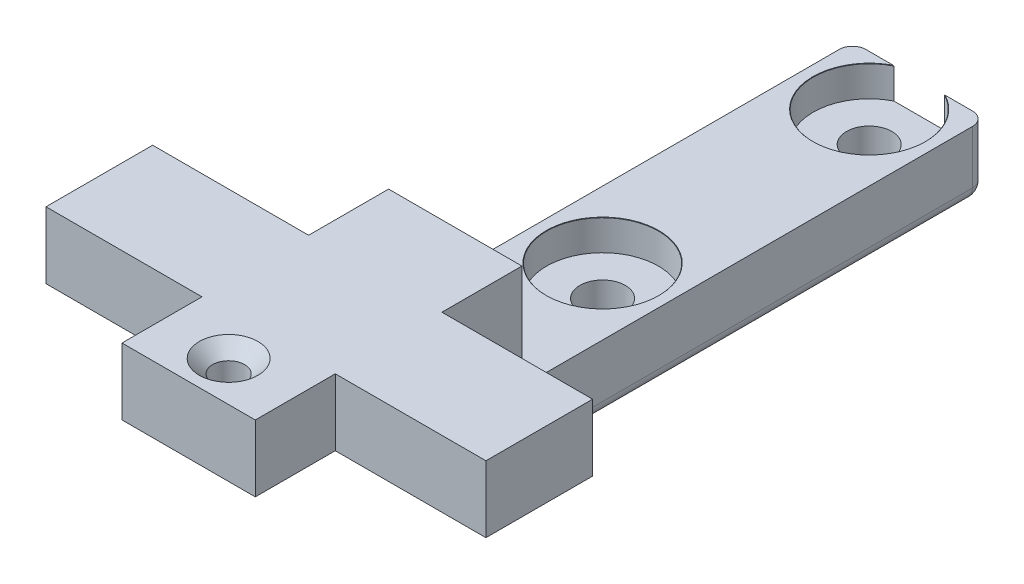
ISO-10303-21;
HEADER;
FILE_DESCRIPTION(('STEP AP214'),'2;1');
FILE_NAME('part.step','',(''),(''),'','','');
FILE_SCHEMA(('AUTOMOTIVE_DESIGN { 1 0 10303 214 1 1 1 1 }'));
ENDSEC;
DATA;
#1=APPLICATION_CONTEXT('core data for automotive mechanical design processes');
#2=APPLICATION_PROTOCOL_DEFINITION('international standard','automotive_design',2000,#1);
#3=PRODUCT_CONTEXT('',#1,'mechanical');
#4=PRODUCT('Part','Part','',(#3));
#5=PRODUCT_RELATED_PRODUCT_CATEGORY('part','',(#4));
#6=PRODUCT_DEFINITION_FORMATION('','',#4);
#7=PRODUCT_DEFINITION_CONTEXT('part definition',#1,'design');
#8=PRODUCT_DEFINITION('design','',#6,#7);
#9=PRODUCT_DEFINITION_SHAPE('','',#8);
#10=(LENGTH_UNIT() NAMED_UNIT(*) SI_UNIT(.MILLI.,.METRE.));
#11=(NAMED_UNIT(*) PLANE_ANGLE_UNIT() SI_UNIT($,.RADIAN.));
#12=(NAMED_UNIT(*) SI_UNIT($,.STERADIAN.) SOLID_ANGLE_UNIT());
#13=UNCERTAINTY_MEASURE_WITH_UNIT(LENGTH_MEASURE(1.E-05),#10,'distance_accuracy_value','');
#14=(GEOMETRIC_REPRESENTATION_CONTEXT(3) GLOBAL_UNCERTAINTY_ASSIGNED_CONTEXT((#13)) GLOBAL_UNIT_ASSIGNED_CONTEXT((#10,
#11,#12)) REPRESENTATION_CONTEXT('',''));
#15=CARTESIAN_POINT('',(0.,0.,0.));
#16=DIRECTION('',(0.,0.,1.));
#17=DIRECTION('',(1.,0.,0.));
#18=AXIS2_PLACEMENT_3D('',#15,#16,#17);
#19=CARTESIAN_POINT('',(0.,0.,3.83624546905827));
#20=DIRECTION('',(0.,0.,-1.));
#21=DIRECTION('',(-1.,0.,0.));
#22=AXIS2_PLACEMENT_3D('',#19,#20,#21);
#23=PLANE('',#22);
#24=DIRECTION('',(0.,-1.,0.));
#25=VECTOR('',#24,1.);
#26=CARTESIAN_POINT('',(0.,7.83,3.83624546905827));
#27=LINE('',#26,#25);
#28=CARTESIAN_POINT('',(0.,12.83,3.83624546905827));
#29=VERTEX_POINT('',#28);
#30=CARTESIAN_POINT('',(0.,7.83,3.83624546905827));
#31=VERTEX_POINT('',#30);
#32=EDGE_CURVE('E335',#29,#31,#27,.T.);
#33=ORIENTED_EDGE('',*,*,#32,.F.);
#34=DIRECTION('',(-1.,0.,0.));
#35=VECTOR('',#34,1.);
#36=CARTESIAN_POINT('',(21.3,12.83,3.83624546905827));
#37=LINE('',#36,#35);
#38=CARTESIAN_POINT('',(-11.7,12.83,3.83624546905827));
#39=VERTEX_POINT('',#38);
#40=EDGE_CURVE('E355',#29,#39,#37,.T.);
#41=ORIENTED_EDGE('',*,*,#40,.T.);
#42=DIRECTION('',(0.,-1.,0.));
#43=VECTOR('',#42,1.);
#44=CARTESIAN_POINT('',(-11.7,12.83,3.83624546905827));
#45=LINE('',#44,#43);
#46=CARTESIAN_POINT('',(-11.7,7.83,3.83624546905827));
#47=VERTEX_POINT('',#46);
#48=EDGE_CURVE('E359',#39,#47,#45,.T.);
#49=ORIENTED_EDGE('',*,*,#48,.T.);
#50=DIRECTION('',(1.,0.,0.));
#51=VECTOR('',#50,1.);
#52=CARTESIAN_POINT('',(21.3,7.83,3.83624546905827));
#53=LINE('',#52,#51);
#54=EDGE_CURVE('E362',#47,#31,#53,.T.);
#55=ORIENTED_EDGE('',*,*,#54,.T.);
#56=EDGE_LOOP('',(#33,#41,#49,#55));
#57=FACE_BOUND('',#56,.T.);
#58=ADVANCED_FACE('F33',(#57),#23,.F.);
#59=DIRECTION('',(0.,1.,0.));
#60=VECTOR('',#59,1.);
#61=CARTESIAN_POINT('',(10.,7.83,3.83624546905827));
#62=LINE('',#61,#60);
#63=CARTESIAN_POINT('',(10.,7.83,3.83624546905827));
#64=VERTEX_POINT('',#63);
#65=CARTESIAN_POINT('',(10.,12.83,3.83624546905827));
#66=VERTEX_POINT('',#65);
#67=EDGE_CURVE('E328',#64,#66,#62,.T.);
#68=ORIENTED_EDGE('',*,*,#67,.F.);
#69=CARTESIAN_POINT('',(21.3,7.83,3.83624546905827));
#70=VERTEX_POINT('',#69);
#71=EDGE_CURVE('E361',#64,#70,#53,.T.);
#72=ORIENTED_EDGE('',*,*,#71,.T.);
#73=DIRECTION('',(0.,1.,0.));
#74=VECTOR('',#73,1.);
#75=CARTESIAN_POINT('',(21.3,12.83,3.83624546905827));
#76=LINE('',#75,#74);
#77=CARTESIAN_POINT('',(21.3,12.83,3.83624546905827));
#78=VERTEX_POINT('',#77);
#79=EDGE_CURVE('E352',#70,#78,#76,.T.);
#80=ORIENTED_EDGE('',*,*,#79,.T.);
#81=EDGE_CURVE('E357',#78,#66,#37,.T.);
#82=ORIENTED_EDGE('',*,*,#81,.T.);
#83=EDGE_LOOP('',(#68,#72,#80,#82));
#84=FACE_BOUND('',#83,.T.);
#85=ADVANCED_FACE('F440',(#84),#23,.F.);
#86=CARTESIAN_POINT('',(0.,5.,-4.16375453094173));
#87=DIRECTION('',(0.,0.,-1.));
#88=DIRECTION('',(-1.,0.,0.));
#89=AXIS2_PLACEMENT_3D('',#86,#87,#88);
#90=PLANE('',#89);
#91=DIRECTION('',(0.,-1.,0.));
#92=VECTOR('',#91,1.);
#93=CARTESIAN_POINT('',(10.,5.,-4.16375453094173));
#94=LINE('',#93,#92);
#95=CARTESIAN_POINT('',(10.,6.83,-4.16375453094173));
#96=VERTEX_POINT('',#95);
#97=CARTESIAN_POINT('',(10.,1.,-4.16375453094173));
#98=VERTEX_POINT('',#97);
#99=EDGE_CURVE('E411',#96,#98,#94,.T.);
#100=ORIENTED_EDGE('',*,*,#99,.F.);
#101=DIRECTION('',(1.,0.,0.));
#102=VECTOR('',#101,1.);
#103=CARTESIAN_POINT('',(0.,6.83,-4.16375453094173));
#104=LINE('',#103,#102);
#105=CARTESIAN_POINT('',(0.,6.83,-4.16375453094173));
#106=VERTEX_POINT('',#105);
#107=EDGE_CURVE('E240',#96,#106,#104,.F.);
#108=ORIENTED_EDGE('',*,*,#107,.T.);
#109=DIRECTION('',(0.,-1.,0.));
#110=VECTOR('',#109,1.);
#111=CARTESIAN_POINT('',(0.,5.,-4.16375453094173));
#112=LINE('',#111,#110);
#113=CARTESIAN_POINT('',(0.,1.,-4.16375453094173));
#114=VERTEX_POINT('',#113);
#115=EDGE_CURVE('E415',#106,#114,#112,.T.);
#116=ORIENTED_EDGE('',*,*,#115,.T.);
#117=DIRECTION('',(1.,0.,0.));
#118=VECTOR('',#117,1.);
#119=CARTESIAN_POINT('',(0.,1.,-4.16375453094173));
#120=LINE('',#119,#118);
#121=EDGE_CURVE('E237',#114,#98,#120,.T.);
#122=ORIENTED_EDGE('',*,*,#121,.T.);
#123=EDGE_LOOP('',(#100,#108,#116,#122));
#124=FACE_BOUND('',#123,.T.);
#125=ADVANCED_FACE('F446',(#124),#90,.F.);
#126=CARTESIAN_POINT('',(0.,5.,-44.9637545309417));
#127=DIRECTION('',(1.,0.,0.));
#128=DIRECTION('',(0.,0.,-1.));
#129=AXIS2_PLACEMENT_3D('',#126,#127,#128);
#130=PLANE('',#129);
#131=DIRECTION('',(0.,0.,1.));
#132=VECTOR('',#131,1.);
#133=CARTESIAN_POINT('',(0.,5.,-44.9637545309417));
#134=LINE('',#133,#132);
#135=CARTESIAN_POINT('',(0.,5.,-43.9637545309417));
#136=VERTEX_POINT('',#135);
#137=CARTESIAN_POINT('',(0.,5.,-10.1637545309417));
#138=VERTEX_POINT('',#137);
#139=EDGE_CURVE('E403',#136,#138,#134,.T.);
#140=ORIENTED_EDGE('',*,*,#139,.F.);
#141=DIRECTION('',(0.,-1.,0.));
#142=VECTOR('',#141,1.);
#143=CARTESIAN_POINT('',(0.,5.,-43.9637545309417));
#144=LINE('',#143,#142);
#145=CARTESIAN_POINT('',(0.,1.,-43.9637545309417));
#146=VERTEX_POINT('',#145);
#147=EDGE_CURVE('E257',#136,#146,#144,.T.);
#148=ORIENTED_EDGE('',*,*,#147,.T.);
#149=DIRECTION('',(0.,0.,1.));
#150=VECTOR('',#149,1.);
#151=CARTESIAN_POINT('',(0.,1.,-44.9637545309417));
#152=LINE('',#151,#150);
#153=EDGE_CURVE('E255',#146,#114,#152,.T.);
#154=ORIENTED_EDGE('',*,*,#153,.T.);
#155=ORIENTED_EDGE('',*,*,#115,.F.);
#156=CARTESIAN_POINT('',(0.,6.83,-3.16375453094173));
#157=DIRECTION('',(1.,0.,0.));
#158=DIRECTION('',(0.,0.,-1.));
#159=AXIS2_PLACEMENT_3D('',#156,#157,#158);
#160=CIRCLE('',#159,1.);
#161=CARTESIAN_POINT('',(0.,7.83,-3.16375453094173));
#162=VERTEX_POINT('',#161);
#163=EDGE_CURVE('E11',#106,#162,#160,.T.);
#164=ORIENTED_EDGE('',*,*,#163,.T.);
#165=DIRECTION('',(0.,0.,1.));
#166=VECTOR('',#165,1.);
#167=CARTESIAN_POINT('',(0.,7.83,-44.9637545309417));
#168=LINE('',#167,#166);
#169=CARTESIAN_POINT('',(0.,7.83,-4.16375453094173));
#170=VERTEX_POINT('',#169);
#171=EDGE_CURVE('E49',#170,#162,#168,.T.);
#172=ORIENTED_EDGE('',*,*,#171,.F.);
#173=CARTESIAN_POINT('',(0.,12.83,-4.16375453094173));
#174=VERTEX_POINT('',#173);
#175=EDGE_CURVE('E206',#174,#170,#112,.T.);
#176=ORIENTED_EDGE('',*,*,#175,.F.);
#177=DIRECTION('',(0.,0.,1.));
#178=VECTOR('',#177,1.);
#179=CARTESIAN_POINT('',(0.,12.83,-4.16375453094173));
#180=LINE('',#179,#178);
#181=CARTESIAN_POINT('',(0.,12.83,-10.1637545309417));
#182=VERTEX_POINT('',#181);
#183=EDGE_CURVE('E392',#182,#174,#180,.T.);
#184=ORIENTED_EDGE('',*,*,#183,.F.);
#185=DIRECTION('',(0.,-1.,0.));
#186=VECTOR('',#185,1.);
#187=CARTESIAN_POINT('',(0.,12.83,-10.1637545309417));
#188=LINE('',#187,#186);
#189=EDGE_CURVE('E395',#182,#138,#188,.T.);
#190=ORIENTED_EDGE('',*,*,#189,.T.);
#191=EDGE_LOOP('',(#140,#148,#154,#155,#164,#172,#176,#184,#190));
#192=FACE_BOUND('',#191,.T.);
#193=ADVANCED_FACE('F488',(#192),#130,.F.);
#194=CARTESIAN_POINT('',(10.,5.,-44.9637545309417));
#195=DIRECTION('',(-1.,0.,0.));
#196=DIRECTION('',(0.,0.,1.));
#197=AXIS2_PLACEMENT_3D('',#194,#195,#196);
#198=PLANE('',#197);
#199=ORIENTED_EDGE('',*,*,#99,.T.);
#200=DIRECTION('',(0.,0.,-1.));
#201=VECTOR('',#200,1.);
#202=CARTESIAN_POINT('',(10.,1.,-44.9637545309417));
#203=LINE('',#202,#201);
#204=CARTESIAN_POINT('',(10.,1.,-43.9637545309417));
#205=VERTEX_POINT('',#204);
#206=EDGE_CURVE('E253',#98,#205,#203,.T.);
#207=ORIENTED_EDGE('',*,*,#206,.T.);
#208=DIRECTION('',(0.,-1.,0.));
#209=VECTOR('',#208,1.);
#210=CARTESIAN_POINT('',(10.,5.,-43.9637545309417));
#211=LINE('',#210,#209);
#212=CARTESIAN_POINT('',(10.,5.,-43.9637545309417));
#213=VERTEX_POINT('',#212);
#214=EDGE_CURVE('E251',#205,#213,#211,.F.);
#215=ORIENTED_EDGE('',*,*,#214,.T.);
#216=DIRECTION('',(0.,0.,-1.));
#217=VECTOR('',#216,1.);
#218=CARTESIAN_POINT('',(10.,5.,-44.9637545309417));
#219=LINE('',#218,#217);
#220=CARTESIAN_POINT('',(10.,5.,-10.1637545309417));
#221=VERTEX_POINT('',#220);
#222=EDGE_CURVE('E405',#221,#213,#219,.T.);
#223=ORIENTED_EDGE('',*,*,#222,.F.);
#224=DIRECTION('',(0.,-1.,0.));
#225=VECTOR('',#224,1.);
#226=CARTESIAN_POINT('',(10.,12.83,-10.1637545309417));
#227=LINE('',#226,#225);
#228=CARTESIAN_POINT('',(10.,12.83,-10.1637545309417));
#229=VERTEX_POINT('',#228);
#230=EDGE_CURVE('E400',#229,#221,#227,.T.);
#231=ORIENTED_EDGE('',*,*,#230,.F.);
#232=DIRECTION('',(0.,0.,-1.));
#233=VECTOR('',#232,1.);
#234=CARTESIAN_POINT('',(10.,12.83,-4.16375453094173));
#235=LINE('',#234,#233);
#236=CARTESIAN_POINT('',(10.,12.83,-4.16375453094173));
#237=VERTEX_POINT('',#236);
#238=EDGE_CURVE('E387',#237,#229,#235,.T.);
#239=ORIENTED_EDGE('',*,*,#238,.F.);
#240=CARTESIAN_POINT('',(10.,7.83,-4.16375453094173));
#241=VERTEX_POINT('',#240);
#242=EDGE_CURVE('E412',#237,#241,#94,.T.);
#243=ORIENTED_EDGE('',*,*,#242,.T.);
#244=DIRECTION('',(0.,0.,-1.));
#245=VECTOR('',#244,1.);
#246=CARTESIAN_POINT('',(10.,7.83,-44.9637545309417));
#247=LINE('',#246,#245);
#248=CARTESIAN_POINT('',(10.,7.83,-3.16375453094173));
#249=VERTEX_POINT('',#248);
#250=EDGE_CURVE('E235',#249,#241,#247,.T.);
#251=ORIENTED_EDGE('',*,*,#250,.F.);
#252=CARTESIAN_POINT('',(10.,6.83,-3.16375453094173));
#253=DIRECTION('',(-1.,0.,0.));
#254=DIRECTION('',(0.,0.,1.));
#255=AXIS2_PLACEMENT_3D('',#252,#253,#254);
#256=CIRCLE('',#255,1.);
#257=EDGE_CURVE('E42',#249,#96,#256,.T.);
#258=ORIENTED_EDGE('',*,*,#257,.T.);
#259=EDGE_LOOP('',(#199,#207,#215,#223,#231,#239,#243,#251,#258));
#260=FACE_BOUND('',#259,.T.);
#261=ADVANCED_FACE('F485',(#260),#198,.F.);
#262=CARTESIAN_POINT('',(0.,5.,-44.9637545309417));
#263=DIRECTION('',(0.,0.,1.));
#264=DIRECTION('',(1.,0.,0.));
#265=AXIS2_PLACEMENT_3D('',#262,#263,#264);
#266=PLANE('',#265);
#267=DIRECTION('',(-1.,0.,0.));
#268=VECTOR('',#267,1.);
#269=CARTESIAN_POINT('',(0.,1.,-44.9637545309417));
#270=LINE('',#269,#268);
#271=CARTESIAN_POINT('',(9.,1.,-44.9637545309417));
#272=VERTEX_POINT('',#271);
#273=CARTESIAN_POINT('',(1.,1.,-44.9637545309417));
#274=VERTEX_POINT('',#273);
#275=EDGE_CURVE('E57',#272,#274,#270,.T.);
#276=ORIENTED_EDGE('',*,*,#275,.T.);
#277=DIRECTION('',(0.,-1.,0.));
#278=VECTOR('',#277,1.);
#279=CARTESIAN_POINT('',(1.,5.,-44.9637545309417));
#280=LINE('',#279,#278);
#281=CARTESIAN_POINT('',(1.,5.,-44.9637545309417));
#282=VERTEX_POINT('',#281);
#283=EDGE_CURVE('E262',#274,#282,#280,.F.);
#284=ORIENTED_EDGE('',*,*,#283,.T.);
#285=DIRECTION('',(-1.,0.,0.));
#286=VECTOR('',#285,1.);
#287=CARTESIAN_POINT('',(0.,5.,-44.9637545309417));
#288=LINE('',#287,#286);
#289=CARTESIAN_POINT('',(3.05368938758482,5.,-44.9637545309417));
#290=VERTEX_POINT('',#289);
#291=EDGE_CURVE('E408',#290,#282,#288,.T.);
#292=ORIENTED_EDGE('',*,*,#291,.F.);
#293=CARTESIAN_POINT('',(-3.50521343344667,10.0702221893006,-44.9637545309417));
#294=CARTESIAN_POINT('',(-3.38006383031921,9.9557112747247,-44.9637545309417));
#295=CARTESIAN_POINT('',(-3.25471173164179,9.84142176084376,-44.9637545309417));
#296=CARTESIAN_POINT('',(-3.00354421713998,9.61335096867708,-44.9637545309417));
#297=CARTESIAN_POINT('',(-2.87772879748715,9.49956969460822,-44.9637545309417));
#298=CARTESIAN_POINT('',(-2.49944315265946,9.15903518832231,-44.9637545309417));
#299=CARTESIAN_POINT('',(-2.24619307437607,8.933145857287,-44.9637545309417));
#300=CARTESIAN_POINT('',(-1.73525714478413,8.48288544879097,-44.9637545309417));
#301=CARTESIAN_POINT('',(-1.47755280228144,8.25853531963654,-44.9637545309417));
#302=CARTESIAN_POINT('',(-0.958544818709284,7.81408579408632,-44.9637545309417));
#303=CARTESIAN_POINT('',(-0.697241643544174,7.59398585616058,-44.9637545309417));
#304=CARTESIAN_POINT('',(-0.212340753148528,7.19491088458394,-44.9637545309417));
#305=CARTESIAN_POINT('',(0.0105197661774254,7.01504210524547,-44.9637545309417));
#306=CARTESIAN_POINT('',(0.460934086625559,6.66109460923798,-44.9637545309417));
#307=CARTESIAN_POINT('',(0.688489178353312,6.48701752009945,-44.9637545309417));
#308=CARTESIAN_POINT('',(1.03436033301427,6.23236014686013,-44.9637545309417));
#309=CARTESIAN_POINT('',(1.15033448708684,6.14860021890708,-44.9637545309417));
#310=CARTESIAN_POINT('',(1.38410912034105,5.98367421772422,-44.9637545309417));
#311=CARTESIAN_POINT('',(1.50190949608081,5.90250799837158,-44.9637545309417));
#312=CARTESIAN_POINT('',(1.73958294702353,5.74340327268832,-44.9637545309417));
#313=CARTESIAN_POINT('',(1.85945483383583,5.6654629974765,-44.9637545309417));
#314=CARTESIAN_POINT('',(2.10170549239995,5.51353407407672,-44.9637545309417));
#315=CARTESIAN_POINT('',(2.22408449947011,5.43954579919639,-44.9637545309417));
#316=CARTESIAN_POINT('',(2.46942868388189,5.29788032772839,-44.9637545309417));
#317=CARTESIAN_POINT('',(2.5923404886807,5.23011125107953,-44.9637545309417));
#318=CARTESIAN_POINT('',(2.84130048011066,5.10064240675096,-44.9637545309417));
#319=CARTESIAN_POINT('',(2.96734772483615,5.03894084329404,-44.9637545309417));
#320=CARTESIAN_POINT('',(3.22279307861923,4.92325429689572,-44.9637545309417));
#321=CARTESIAN_POINT('',(3.35218713190918,4.86926044750132,-44.9637545309417));
#322=CARTESIAN_POINT('',(3.6145984369742,4.7708810699504,-44.9637545309417));
#323=CARTESIAN_POINT('',(3.74761465066696,4.72649282086375,-44.9637545309417));
#324=CARTESIAN_POINT('',(3.99031819098881,4.65717103685499,-44.9637545309417));
#325=CARTESIAN_POINT('',(4.09939859629446,4.63012495217266,-44.9637545309417));
#326=CARTESIAN_POINT('',(4.31936969015652,4.58474906691519,-44.9637545309417));
#327=CARTESIAN_POINT('',(4.4302601221872,4.56641804210515,-44.9637545309417));
#328=CARTESIAN_POINT('',(4.65295406011985,4.53940726873561,-44.9637545309417));
#329=CARTESIAN_POINT('',(4.76475469709095,4.53070420635281,-44.9637545309417));
#330=CARTESIAN_POINT('',(4.9886906540197,4.52334731231274,-44.9637545309417));
#331=CARTESIAN_POINT('',(5.1008259704427,4.52469337489629,-44.9637545309417));
#332=CARTESIAN_POINT('',(5.32442550804682,4.53735287218826,-44.9637545309417));
#333=CARTESIAN_POINT('',(5.43589022756192,4.54865764774182,-44.9637545309417));
#334=CARTESIAN_POINT('',(5.65746007346739,4.58061770542398,-44.9637545309417));
#335=CARTESIAN_POINT('',(5.76756508248875,4.6012737890333,-44.9637545309417));
#336=CARTESIAN_POINT('',(5.98615675524417,4.6510336664652,-44.9637545309417));
#337=CARTESIAN_POINT('',(6.09463787411123,4.68016151024235,-44.9637545309417));
#338=CARTESIAN_POINT('',(6.3093477427324,4.74569697272206,-44.9637545309417));
#339=CARTESIAN_POINT('',(6.41557654614625,4.78210441777749,-44.9637545309417));
#340=CARTESIAN_POINT('',(6.65460648143794,4.87192554997566,-44.9637545309417));
#341=CARTESIAN_POINT('',(6.78668119530072,4.92726261649128,-44.9637545309417));
#342=CARTESIAN_POINT('',(7.04725170949785,5.04586278370237,-44.9637545309417));
#343=CARTESIAN_POINT('',(7.17574566244965,5.10912988639145,-44.9637545309417));
#344=CARTESIAN_POINT('',(7.42967902220847,5.24200279605186,-44.9637545309417));
#345=CARTESIAN_POINT('',(7.55511259792081,5.31161966262272,-44.9637545309417));
#346=CARTESIAN_POINT('',(7.8031225555306,5.45579233636523,-44.9637545309417));
#347=CARTESIAN_POINT('',(7.92569836028067,5.53034912970799,-44.9637545309417));
#348=CARTESIAN_POINT('',(8.1696188530214,5.68416797908847,-44.9637545309417));
#349=CARTESIAN_POINT('',(8.29093784441693,5.76347059974671,-44.9637545309417));
#350=CARTESIAN_POINT('',(8.53141653891184,5.92529260563417,-44.9637545309417));
#351=CARTESIAN_POINT('',(8.6505760549365,6.00781226762185,-44.9637545309417));
#352=CARTESIAN_POINT('',(9.00536841106583,6.25929415315998,-44.9637545309417));
#353=CARTESIAN_POINT('',(9.23824963607487,6.43213707335197,-44.9637545309417));
#354=CARTESIAN_POINT('',(9.64778394274925,6.74586577727608,-44.9637545309417));
#355=CARTESIAN_POINT('',(9.82549967448314,6.88538214811452,-44.9637545309417));
#356=CARTESIAN_POINT('',(10.178287619643,7.16764789395198,-44.9637545309417));
#357=CARTESIAN_POINT('',(10.3533603423799,7.31039663246619,-44.9637545309417));
#358=CARTESIAN_POINT('',(10.701521538204,7.59851101021024,-44.9637545309417));
#359=CARTESIAN_POINT('',(10.8746086667732,7.74387826896992,-44.9637545309417));
#360=CARTESIAN_POINT('',(11.2190812769881,8.03662897629508,-44.9637545309417));
#361=CARTESIAN_POINT('',(11.3904666743927,8.18401252382299,-44.9637545309417));
#362=CARTESIAN_POINT('',(11.8895233369443,8.61727817807953,-44.9637545309417));
#363=CARTESIAN_POINT('',(12.2153118641579,8.90532866982431,-44.9637545309417));
#364=CARTESIAN_POINT('',(12.7010929291007,9.34029193824554,-44.9637545309417));
#365=CARTESIAN_POINT('',(12.8624542393485,9.48568557309918,-44.9637545309417));
#366=CARTESIAN_POINT('',(13.1843915470707,9.7773395692038,-44.9637545309417));
#367=CARTESIAN_POINT('',(13.3449675454714,9.92359992943216,-44.9637545309417));
#368=CARTESIAN_POINT('',(13.5052134334467,10.0702221893006,-44.9637545309417));
#369=B_SPLINE_CURVE_WITH_KNOTS('',3,(#293,#294,#295,#296,#297,#298,#299,#300,#301,#302,#303,
#304,#305,#306,#307,#308,#309,#310,#311,#312,#313,#314,#315,#316,#317,#318,#319,#320,#321,#322,
#323,#324,#325,#326,#327,#328,#329,#330,#331,#332,#333,#334,#335,#336,#337,#338,#339,#340,#341,
#342,#343,#344,#345,#346,#347,#348,#349,#350,#351,#352,#353,#354,#355,#356,#357,#358,#359,#360,
#361,#362,#363,#364,#365,#366,#367,#368),.UNSPECIFIED.,.F.,.F.,(4,2,2,2,2,2,2,2,2,2,2,2,2,2,2,2,
2,2,2,2,2,2,2,2,2,2,2,2,2,2,2,2,2,2,2,2,2,4),(0.,0.508896807007594,1.0177978285409,
2.03584217220746,3.06084885312447,4.08572406139005,4.94483527532724,5.80418590444394,
6.23333416844511,6.66245821256572,7.09134375068328,7.52026973012572,7.94120671382053,
8.36201873715975,8.78234271605492,9.20254747558264,9.53939054783262,9.87618628856907,
10.2121646911458,10.5481395578177,10.8838225805486,11.2195343794058,11.5562086702774,
11.8928749311014,12.3221271096198,12.7515967945584,13.1818293311928,13.6121480166265,
14.0469003620399,14.4816901916036,15.351503181886,16.0292810699296,16.7069266379187,
17.3850067853204,18.0631203341624,19.3676676554342,20.0192726649873,20.6708769058944),.UNSPECIFIED.);
#370=CARTESIAN_POINT('',(3.10857196806224,4.97500000000001,-44.9637545309417));
#371=VERTEX_POINT('',#370);
#372=EDGE_CURVE('E208',#290,#371,#369,.T.);
#373=ORIENTED_EDGE('',*,*,#372,.T.);
#374=DIRECTION('',(0.,1.,0.));
#375=VECTOR('',#374,1.);
#376=CARTESIAN_POINT('',(3.10857196806224,5.,-44.9637545309417));
#377=LINE('',#376,#375);
#378=CARTESIAN_POINT('',(3.10857196806224,2.70000000000001,-44.9637545309417));
#379=VERTEX_POINT('',#378);
#380=EDGE_CURVE('E214',#371,#379,#377,.F.);
#381=ORIENTED_EDGE('',*,*,#380,.T.);
#382=DIRECTION('',(1.,0.,0.));
#383=VECTOR('',#382,1.);
#384=CARTESIAN_POINT('',(0.,2.70000000000001,-44.9637545309417));
#385=LINE('',#384,#383);
#386=CARTESIAN_POINT('',(6.89142803193776,2.70000000000001,-44.9637545309417));
#387=VERTEX_POINT('',#386);
#388=EDGE_CURVE('E219',#379,#387,#385,.T.);
#389=ORIENTED_EDGE('',*,*,#388,.T.);
#390=DIRECTION('',(0.,1.,0.));
#391=VECTOR('',#390,1.);
#392=CARTESIAN_POINT('',(6.89142803193776,5.,-44.9637545309417));
#393=LINE('',#392,#391);
#394=CARTESIAN_POINT('',(6.89142803193777,4.97500000000001,-44.9637545309417));
#395=VERTEX_POINT('',#394);
#396=EDGE_CURVE('E205',#387,#395,#393,.T.);
#397=ORIENTED_EDGE('',*,*,#396,.T.);
#398=CARTESIAN_POINT('',(6.94631061241518,5.,-44.9637545309417));
#399=VERTEX_POINT('',#398);
#400=EDGE_CURVE('E196',#395,#399,#369,.T.);
#401=ORIENTED_EDGE('',*,*,#400,.T.);
#402=CARTESIAN_POINT('',(9.,5.,-44.9637545309417));
#403=VERTEX_POINT('',#402);
#404=EDGE_CURVE('E409',#403,#399,#288,.T.);
#405=ORIENTED_EDGE('',*,*,#404,.F.);
#406=DIRECTION('',(0.,-1.,0.));
#407=VECTOR('',#406,1.);
#408=CARTESIAN_POINT('',(9.,5.,-44.9637545309417));
#409=LINE('',#408,#407);
#410=EDGE_CURVE('E260',#403,#272,#409,.T.);
#411=ORIENTED_EDGE('',*,*,#410,.T.);
#412=EDGE_LOOP('',(#276,#284,#292,#373,#381,#389,#397,#401,#405,#411));
#413=FACE_BOUND('',#412,.T.);
#414=ADVANCED_FACE('F218',(#413),#266,.F.);
#415=CARTESIAN_POINT('',(0.,5.,0.));
#416=DIRECTION('',(0.,1.,0.));
#417=DIRECTION('',(0.,0.,1.));
#418=AXIS2_PLACEMENT_3D('',#415,#416,#417);
#419=PLANE('',#418);
#420=CARTESIAN_POINT('',(5.,5.,-21.2137545309417));
#421=DIRECTION('',(0.,1.,0.));
#422=DIRECTION('',(0.,0.,1.));
#423=AXIS2_PLACEMENT_3D('',#420,#421,#422);
#424=CIRCLE('',#423,4.225);
#425=CARTESIAN_POINT('',(5.,5.,-16.9887545309417));
#426=VERTEX_POINT('',#425);
#427=EDGE_CURVE('E290',#426,#426,#424,.T.);
#428=ORIENTED_EDGE('',*,*,#427,.F.);
#429=EDGE_LOOP('',(#428));
#430=FACE_BOUND('',#429,.T.);
#431=ORIENTED_EDGE('',*,*,#291,.T.);
#432=CARTESIAN_POINT('',(1.,5.,-43.9637545309417));
#433=DIRECTION('',(0.,1.,0.));
#434=DIRECTION('',(0.,0.,1.));
#435=AXIS2_PLACEMENT_3D('',#432,#433,#434);
#436=CIRCLE('',#435,1.);
#437=EDGE_CURVE('E266',#282,#136,#436,.T.);
#438=ORIENTED_EDGE('',*,*,#437,.T.);
#439=ORIENTED_EDGE('',*,*,#139,.T.);
#440=DIRECTION('',(-1.,0.,0.));
#441=VECTOR('',#440,1.);
#442=CARTESIAN_POINT('',(10.,5.,-10.1637545309417));
#443=LINE('',#442,#441);
#444=EDGE_CURVE('E386',#221,#138,#443,.T.);
#445=ORIENTED_EDGE('',*,*,#444,.F.);
#446=ORIENTED_EDGE('',*,*,#222,.T.);
#447=CARTESIAN_POINT('',(9.,5.,-43.9637545309417));
#448=DIRECTION('',(0.,1.,0.));
#449=DIRECTION('',(0.,0.,1.));
#450=AXIS2_PLACEMENT_3D('',#447,#448,#449);
#451=CIRCLE('',#450,1.);
#452=EDGE_CURVE('E264',#213,#403,#451,.T.);
#453=ORIENTED_EDGE('',*,*,#452,.T.);
#454=ORIENTED_EDGE('',*,*,#404,.T.);
#455=CARTESIAN_POINT('',(5.,5.,-41.2137545309417));
#456=DIRECTION('',(0.,1.,0.));
#457=DIRECTION('',(0.,0.,1.));
#458=AXIS2_PLACEMENT_3D('',#455,#456,#457);
#459=CIRCLE('',#458,4.225);
#460=EDGE_CURVE('E202',#290,#399,#459,.T.);
#461=ORIENTED_EDGE('',*,*,#460,.F.);
#462=EDGE_LOOP('',(#431,#438,#439,#445,#446,#453,#454,#461));
#463=FACE_BOUND('',#462,.T.);
#464=ADVANCED_FACE('F476',(#430,#463),#419,.T.);
#465=CARTESIAN_POINT('',(0.,0.,0.));
#466=DIRECTION('',(0.,1.,0.));
#467=DIRECTION('',(0.,0.,1.));
#468=AXIS2_PLACEMENT_3D('',#465,#466,#467);
#469=PLANE('',#468);
#470=DIRECTION('',(0.,0.,-1.));
#471=VECTOR('',#470,1.);
#472=CARTESIAN_POINT('',(9.00000000000001,0.,0.));
#473=LINE('',#472,#471);
#474=CARTESIAN_POINT('',(9.,0.,-43.9637545309417));
#475=VERTEX_POINT('',#474);
#476=CARTESIAN_POINT('',(9.00000000000001,0.,-5.16375453094173));
#477=VERTEX_POINT('',#476);
#478=EDGE_CURVE('E246',#475,#477,#473,.F.);
#479=ORIENTED_EDGE('',*,*,#478,.T.);
#480=DIRECTION('',(1.,0.,0.));
#481=VECTOR('',#480,1.);
#482=CARTESIAN_POINT('',(0.,0.,-5.16375453094173));
#483=LINE('',#482,#481);
#484=CARTESIAN_POINT('',(1.,0.,-5.16375453094173));
#485=VERTEX_POINT('',#484);
#486=EDGE_CURVE('E248',#477,#485,#483,.F.);
#487=ORIENTED_EDGE('',*,*,#486,.T.);
#488=DIRECTION('',(0.,0.,1.));
#489=VECTOR('',#488,1.);
#490=CARTESIAN_POINT('',(1.00000000000001,0.,0.));
#491=LINE('',#490,#489);
#492=CARTESIAN_POINT('',(1.,0.,-43.9637545309417));
#493=VERTEX_POINT('',#492);
#494=EDGE_CURVE('E244',#485,#493,#491,.F.);
#495=ORIENTED_EDGE('',*,*,#494,.T.);
#496=DIRECTION('',(-1.,0.,0.));
#497=VECTOR('',#496,1.);
#498=CARTESIAN_POINT('',(0.,0.,-43.9637545309417));
#499=LINE('',#498,#497);
#500=EDGE_CURVE('E242',#493,#475,#499,.F.);
#501=ORIENTED_EDGE('',*,*,#500,.T.);
#502=EDGE_LOOP('',(#479,#487,#495,#501));
#503=FACE_BOUND('',#502,.T.);
#504=CARTESIAN_POINT('',(5.,0.,-21.2137545309417));
#505=DIRECTION('',(0.,1.,0.));
#506=DIRECTION('',(0.,0.,1.));
#507=AXIS2_PLACEMENT_3D('',#504,#505,#506);
#508=CIRCLE('',#507,1.7);
#509=CARTESIAN_POINT('',(5.,0.,-19.5137545309417));
#510=VERTEX_POINT('',#509);
#511=EDGE_CURVE('E306',#510,#510,#508,.T.);
#512=ORIENTED_EDGE('',*,*,#511,.T.);
#513=EDGE_LOOP('',(#512));
#514=FACE_BOUND('',#513,.T.);
#515=CARTESIAN_POINT('',(5.,0.,-41.2137545309417));
#516=DIRECTION('',(0.,1.,0.));
#517=DIRECTION('',(0.,0.,1.));
#518=AXIS2_PLACEMENT_3D('',#515,#516,#517);
#519=CIRCLE('',#518,1.7);
#520=CARTESIAN_POINT('',(5.,0.,-39.5137545309417));
#521=VERTEX_POINT('',#520);
#522=EDGE_CURVE('E314',#521,#521,#519,.T.);
#523=ORIENTED_EDGE('',*,*,#522,.T.);
#524=EDGE_LOOP('',(#523));
#525=FACE_BOUND('',#524,.T.);
#526=ADVANCED_FACE('F474',(#503,#514,#525),#469,.F.);
#527=CARTESIAN_POINT('',(10.,12.83,-10.1637545309417));
#528=DIRECTION('',(0.,0.,1.));
#529=DIRECTION('',(1.,0.,0.));
#530=AXIS2_PLACEMENT_3D('',#527,#528,#529);
#531=PLANE('',#530);
#532=ORIENTED_EDGE('',*,*,#444,.T.);
#533=ORIENTED_EDGE('',*,*,#189,.F.);
#534=DIRECTION('',(-1.,0.,0.));
#535=VECTOR('',#534,1.);
#536=CARTESIAN_POINT('',(10.,12.83,-10.1637545309417));
#537=LINE('',#536,#535);
#538=EDGE_CURVE('E390',#229,#182,#537,.T.);
#539=ORIENTED_EDGE('',*,*,#538,.F.);
#540=ORIENTED_EDGE('',*,*,#230,.T.);
#541=EDGE_LOOP('',(#532,#533,#539,#540));
#542=FACE_BOUND('',#541,.T.);
#543=ADVANCED_FACE('F470',(#542),#531,.F.);
#544=CARTESIAN_POINT('',(0.,12.83,0.));
#545=DIRECTION('',(0.,1.,0.));
#546=DIRECTION('',(0.,0.,1.));
#547=AXIS2_PLACEMENT_3D('',#544,#545,#546);
#548=PLANE('',#547);
#549=CARTESIAN_POINT('',(5.,12.83,6.83624546905827));
#550=DIRECTION('',(0.,1.,0.));
#551=DIRECTION('',(0.,0.,1.));
#552=AXIS2_PLACEMENT_3D('',#549,#550,#551);
#553=CIRCLE('',#552,2.2);
#554=CARTESIAN_POINT('',(5.,12.83,9.03624546905827));
#555=VERTEX_POINT('',#554);
#556=EDGE_CURVE('E317',#555,#555,#553,.T.);
#557=ORIENTED_EDGE('',*,*,#556,.F.);
#558=EDGE_LOOP('',(#557));
#559=FACE_BOUND('',#558,.T.);
#560=ORIENTED_EDGE('',*,*,#238,.T.);
#561=ORIENTED_EDGE('',*,*,#538,.T.);
#562=ORIENTED_EDGE('',*,*,#183,.T.);
#563=DIRECTION('',(-1.,0.,0.));
#564=VECTOR('',#563,1.);
#565=CARTESIAN_POINT('',(21.3,12.83,-4.16375453094173));
#566=LINE('',#565,#564);
#567=CARTESIAN_POINT('',(-11.7,12.83,-4.16375453094173));
#568=VERTEX_POINT('',#567);
#569=EDGE_CURVE('E367',#174,#568,#566,.T.);
#570=ORIENTED_EDGE('',*,*,#569,.T.);
#571=DIRECTION('',(0.,0.,-1.));
#572=VECTOR('',#571,1.);
#573=CARTESIAN_POINT('',(-11.7,12.83,3.83624546905827));
#574=LINE('',#573,#572);
#575=EDGE_CURVE('E380',#39,#568,#574,.T.);
#576=ORIENTED_EDGE('',*,*,#575,.F.);
#577=ORIENTED_EDGE('',*,*,#40,.F.);
#578=DIRECTION('',(0.,0.,-1.));
#579=VECTOR('',#578,1.);
#580=CARTESIAN_POINT('',(0.,12.83,9.83624546905827));
#581=LINE('',#580,#579);
#582=CARTESIAN_POINT('',(0.,12.83,9.83624546905827));
#583=VERTEX_POINT('',#582);
#584=EDGE_CURVE('E334',#583,#29,#581,.T.);
#585=ORIENTED_EDGE('',*,*,#584,.F.);
#586=DIRECTION('',(-1.,0.,0.));
#587=VECTOR('',#586,1.);
#588=CARTESIAN_POINT('',(0.,12.83,9.83624546905827));
#589=LINE('',#588,#587);
#590=CARTESIAN_POINT('',(10.,12.83,9.83624546905827));
#591=VERTEX_POINT('',#590);
#592=EDGE_CURVE('E332',#591,#583,#589,.T.);
#593=ORIENTED_EDGE('',*,*,#592,.F.);
#594=DIRECTION('',(0.,0.,-1.));
#595=VECTOR('',#594,1.);
#596=CARTESIAN_POINT('',(10.,12.83,9.83624546905827));
#597=LINE('',#596,#595);
#598=EDGE_CURVE('E342',#591,#66,#597,.T.);
#599=ORIENTED_EDGE('',*,*,#598,.T.);
#600=ORIENTED_EDGE('',*,*,#81,.F.);
#601=DIRECTION('',(0.,0.,-1.));
#602=VECTOR('',#601,1.);
#603=CARTESIAN_POINT('',(21.3,12.83,3.83624546905827));
#604=LINE('',#603,#602);
#605=CARTESIAN_POINT('',(21.3,12.83,-4.16375453094173));
#606=VERTEX_POINT('',#605);
#607=EDGE_CURVE('E383',#78,#606,#604,.T.);
#608=ORIENTED_EDGE('',*,*,#607,.T.);
#609=EDGE_CURVE('E368',#606,#237,#566,.T.);
#610=ORIENTED_EDGE('',*,*,#609,.T.);
#611=EDGE_LOOP('',(#560,#561,#562,#570,#576,#577,#585,#593,#599,#600,#608,#610));
#612=FACE_BOUND('',#611,.T.);
#613=ADVANCED_FACE('F467',(#559,#612),#548,.T.);
#614=CARTESIAN_POINT('',(0.,0.,-4.16375453094173));
#615=DIRECTION('',(0.,0.,-1.));
#616=DIRECTION('',(-1.,0.,0.));
#617=AXIS2_PLACEMENT_3D('',#614,#615,#616);
#618=PLANE('',#617);
#619=ORIENTED_EDGE('',*,*,#242,.F.);
#620=ORIENTED_EDGE('',*,*,#609,.F.);
#621=DIRECTION('',(0.,1.,0.));
#622=VECTOR('',#621,1.);
#623=CARTESIAN_POINT('',(21.3,12.83,-4.16375453094173));
#624=LINE('',#623,#622);
#625=CARTESIAN_POINT('',(21.3,7.83,-4.16375453094173));
#626=VERTEX_POINT('',#625);
#627=EDGE_CURVE('E351',#626,#606,#624,.T.);
#628=ORIENTED_EDGE('',*,*,#627,.F.);
#629=DIRECTION('',(1.,0.,0.));
#630=VECTOR('',#629,1.);
#631=CARTESIAN_POINT('',(21.3,7.83,-4.16375453094173));
#632=LINE('',#631,#630);
#633=EDGE_CURVE('E373',#241,#626,#632,.T.);
#634=ORIENTED_EDGE('',*,*,#633,.F.);
#635=EDGE_LOOP('',(#619,#620,#628,#634));
#636=FACE_BOUND('',#635,.T.);
#637=ADVANCED_FACE('F456',(#636),#618,.T.);
#638=CARTESIAN_POINT('',(21.3,12.83,3.83624546905827));
#639=DIRECTION('',(-1.,0.,0.));
#640=DIRECTION('',(0.,-1.,0.));
#641=AXIS2_PLACEMENT_3D('',#638,#639,#640);
#642=PLANE('',#641);
#643=ORIENTED_EDGE('',*,*,#627,.T.);
#644=ORIENTED_EDGE('',*,*,#607,.F.);
#645=ORIENTED_EDGE('',*,*,#79,.F.);
#646=DIRECTION('',(0.,0.,-1.));
#647=VECTOR('',#646,1.);
#648=CARTESIAN_POINT('',(21.3,7.83,3.83624546905827));
#649=LINE('',#648,#647);
#650=EDGE_CURVE('E364',#70,#626,#649,.T.);
#651=ORIENTED_EDGE('',*,*,#650,.T.);
#652=EDGE_LOOP('',(#643,#644,#645,#651));
#653=FACE_BOUND('',#652,.T.);
#654=ADVANCED_FACE('F462',(#653),#642,.F.);
#655=CARTESIAN_POINT('',(-11.7,12.83,3.83624546905827));
#656=DIRECTION('',(1.,0.,0.));
#657=DIRECTION('',(0.,1.,0.));
#658=AXIS2_PLACEMENT_3D('',#655,#656,#657);
#659=PLANE('',#658);
#660=DIRECTION('',(0.,-1.,0.));
#661=VECTOR('',#660,1.);
#662=CARTESIAN_POINT('',(-11.7,12.83,-4.16375453094173));
#663=LINE('',#662,#661);
#664=CARTESIAN_POINT('',(-11.7,7.83,-4.16375453094173));
#665=VERTEX_POINT('',#664);
#666=EDGE_CURVE('E371',#568,#665,#663,.T.);
#667=ORIENTED_EDGE('',*,*,#666,.T.);
#668=DIRECTION('',(0.,0.,-1.));
#669=VECTOR('',#668,1.);
#670=CARTESIAN_POINT('',(-11.7,7.83,3.83624546905827));
#671=LINE('',#670,#669);
#672=EDGE_CURVE('E377',#47,#665,#671,.T.);
#673=ORIENTED_EDGE('',*,*,#672,.F.);
#674=ORIENTED_EDGE('',*,*,#48,.F.);
#675=ORIENTED_EDGE('',*,*,#575,.T.);
#676=EDGE_LOOP('',(#667,#673,#674,#675));
#677=FACE_BOUND('',#676,.T.);
#678=ADVANCED_FACE('F459',(#677),#659,.F.);
#679=CARTESIAN_POINT('',(21.3,7.83,3.83624546905827));
#680=DIRECTION('',(0.,1.,0.));
#681=DIRECTION('',(-1.,0.,0.));
#682=AXIS2_PLACEMENT_3D('',#679,#680,#681);
#683=PLANE('',#682);
#684=CARTESIAN_POINT('',(5.,7.83,6.83624546905827));
#685=DIRECTION('',(0.,1.,0.));
#686=DIRECTION('',(-1.,0.,0.));
#687=AXIS2_PLACEMENT_3D('',#684,#685,#686);
#688=CIRCLE('',#687,1.2);
#689=CARTESIAN_POINT('',(3.8,7.83,6.83624546905827));
#690=VERTEX_POINT('',#689);
#691=EDGE_CURVE('E323',#690,#690,#688,.T.);
#692=ORIENTED_EDGE('',*,*,#691,.T.);
#693=EDGE_LOOP('',(#692));
#694=FACE_BOUND('',#693,.T.);
#695=DIRECTION('',(1.,0.,0.));
#696=VECTOR('',#695,1.);
#697=CARTESIAN_POINT('',(10.,7.83,-3.16375453094173));
#698=LINE('',#697,#696);
#699=EDGE_CURVE('E232',#162,#249,#698,.T.);
#700=ORIENTED_EDGE('',*,*,#699,.T.);
#701=ORIENTED_EDGE('',*,*,#250,.T.);
#702=ORIENTED_EDGE('',*,*,#633,.T.);
#703=ORIENTED_EDGE('',*,*,#650,.F.);
#704=ORIENTED_EDGE('',*,*,#71,.F.);
#705=DIRECTION('',(0.,0.,-1.));
#706=VECTOR('',#705,1.);
#707=CARTESIAN_POINT('',(10.,7.83,9.83624546905827));
#708=LINE('',#707,#706);
#709=CARTESIAN_POINT('',(10.,7.83,9.83624546905827));
#710=VERTEX_POINT('',#709);
#711=EDGE_CURVE('E345',#710,#64,#708,.T.);
#712=ORIENTED_EDGE('',*,*,#711,.F.);
#713=DIRECTION('',(1.,0.,0.));
#714=VECTOR('',#713,1.);
#715=CARTESIAN_POINT('',(0.,7.83,9.83624546905827));
#716=LINE('',#715,#714);
#717=CARTESIAN_POINT('',(0.,7.83,9.83624546905827));
#718=VERTEX_POINT('',#717);
#719=EDGE_CURVE('E327',#718,#710,#716,.T.);
#720=ORIENTED_EDGE('',*,*,#719,.F.);
#721=DIRECTION('',(0.,0.,-1.));
#722=VECTOR('',#721,1.);
#723=CARTESIAN_POINT('',(0.,7.83,9.83624546905827));
#724=LINE('',#723,#722);
#725=EDGE_CURVE('E348',#718,#31,#724,.T.);
#726=ORIENTED_EDGE('',*,*,#725,.T.);
#727=ORIENTED_EDGE('',*,*,#54,.F.);
#728=ORIENTED_EDGE('',*,*,#672,.T.);
#729=EDGE_CURVE('E356',#665,#170,#632,.T.);
#730=ORIENTED_EDGE('',*,*,#729,.T.);
#731=ORIENTED_EDGE('',*,*,#171,.T.);
#732=EDGE_LOOP('',(#700,#701,#702,#703,#704,#712,#720,#726,#727,#728,#730,#731));
#733=FACE_BOUND('',#732,.T.);
#734=ADVANCED_FACE('F420',(#694,#733),#683,.F.);
#735=ORIENTED_EDGE('',*,*,#569,.F.);
#736=ORIENTED_EDGE('',*,*,#175,.T.);
#737=ORIENTED_EDGE('',*,*,#729,.F.);
#738=ORIENTED_EDGE('',*,*,#666,.F.);
#739=EDGE_LOOP('',(#735,#736,#737,#738));
#740=FACE_BOUND('',#739,.T.);
#741=ADVANCED_FACE('F452',(#740),#618,.T.);
#742=CARTESIAN_POINT('',(0.,7.83,9.83624546905827));
#743=DIRECTION('',(1.,0.,0.));
#744=DIRECTION('',(0.,1.,0.));
#745=AXIS2_PLACEMENT_3D('',#742,#743,#744);
#746=PLANE('',#745);
#747=ORIENTED_EDGE('',*,*,#32,.T.);
#748=ORIENTED_EDGE('',*,*,#725,.F.);
#749=DIRECTION('',(0.,-1.,0.));
#750=VECTOR('',#749,1.);
#751=CARTESIAN_POINT('',(0.,7.83,9.83624546905827));
#752=LINE('',#751,#750);
#753=EDGE_CURVE('E324',#583,#718,#752,.T.);
#754=ORIENTED_EDGE('',*,*,#753,.F.);
#755=ORIENTED_EDGE('',*,*,#584,.T.);
#756=EDGE_LOOP('',(#747,#748,#754,#755));
#757=FACE_BOUND('',#756,.T.);
#758=ADVANCED_FACE('F450',(#757),#746,.F.);
#759=CARTESIAN_POINT('',(10.,7.83,9.83624546905827));
#760=DIRECTION('',(-1.,0.,0.));
#761=DIRECTION('',(0.,0.,1.));
#762=AXIS2_PLACEMENT_3D('',#759,#760,#761);
#763=PLANE('',#762);
#764=ORIENTED_EDGE('',*,*,#67,.T.);
#765=ORIENTED_EDGE('',*,*,#598,.F.);
#766=DIRECTION('',(0.,1.,0.));
#767=VECTOR('',#766,1.);
#768=CARTESIAN_POINT('',(10.,7.83,9.83624546905827));
#769=LINE('',#768,#767);
#770=EDGE_CURVE('E330',#710,#591,#769,.T.);
#771=ORIENTED_EDGE('',*,*,#770,.F.);
#772=ORIENTED_EDGE('',*,*,#711,.T.);
#773=EDGE_LOOP('',(#764,#765,#771,#772));
#774=FACE_BOUND('',#773,.T.);
#775=ADVANCED_FACE('F436',(#774),#763,.F.);
#776=CARTESIAN_POINT('',(0.,0.,9.83624546905827));
#777=DIRECTION('',(0.,0.,-1.));
#778=DIRECTION('',(-1.,0.,0.));
#779=AXIS2_PLACEMENT_3D('',#776,#777,#778);
#780=PLANE('',#779);
#781=ORIENTED_EDGE('',*,*,#753,.T.);
#782=ORIENTED_EDGE('',*,*,#719,.T.);
#783=ORIENTED_EDGE('',*,*,#770,.T.);
#784=ORIENTED_EDGE('',*,*,#592,.T.);
#785=EDGE_LOOP('',(#781,#782,#783,#784));
#786=FACE_BOUND('',#785,.T.);
#787=ADVANCED_FACE('F426',(#786),#780,.F.);
#788=CARTESIAN_POINT('',(5.,12.83,6.83624546905827));
#789=DIRECTION('',(0.,1.,0.));
#790=DIRECTION('',(0.,0.,1.));
#791=AXIS2_PLACEMENT_3D('',#788,#789,#790);
#792=CYLINDRICAL_SURFACE('',#791,1.2);
#793=CARTESIAN_POINT('',(5.,11.83,6.83624546905827));
#794=DIRECTION('',(0.,1.,0.));
#795=DIRECTION('',(0.,0.,1.));
#796=AXIS2_PLACEMENT_3D('',#793,#794,#795);
#797=CIRCLE('',#796,1.2);
#798=CARTESIAN_POINT('',(5.,11.83,8.03624546905827));
#799=VERTEX_POINT('',#798);
#800=EDGE_CURVE('E320',#799,#799,#797,.T.);
#801=ORIENTED_EDGE('',*,*,#800,.T.);
#802=EDGE_LOOP('',(#801));
#803=FACE_BOUND('',#802,.T.);
#804=ORIENTED_EDGE('',*,*,#691,.F.);
#805=EDGE_LOOP('',(#804));
#806=FACE_BOUND('',#805,.T.);
#807=ADVANCED_FACE('F423',(#803,#806),#792,.F.);
#808=CARTESIAN_POINT('',(5.,12.83,6.83624546905827));
#809=DIRECTION('',(0.,1.,0.));
#810=DIRECTION('',(0.,0.,1.));
#811=AXIS2_PLACEMENT_3D('',#808,#809,#810);
#812=CONICAL_SURFACE('',#811,2.2,0.785398163397447);
#813=ORIENTED_EDGE('',*,*,#800,.F.);
#814=EDGE_LOOP('',(#813));
#815=FACE_BOUND('',#814,.T.);
#816=ORIENTED_EDGE('',*,*,#556,.T.);
#817=EDGE_LOOP('',(#816));
#818=FACE_BOUND('',#817,.T.);
#819=ADVANCED_FACE('F425',(#815,#818),#812,.F.);
#820=CARTESIAN_POINT('',(9.2,2.70000000000001,-41.2137545309417));
#821=DIRECTION('',(0.,-1.,0.));
#822=DIRECTION('',(0.,0.,-1.));
#823=AXIS2_PLACEMENT_3D('',#820,#821,#822);
#824=PLANE('',#823);
#825=CARTESIAN_POINT('',(5.,2.70000000000001,-41.2137545309417));
#826=DIRECTION('',(0.,1.,0.));
#827=DIRECTION('',(0.,0.,1.));
#828=AXIS2_PLACEMENT_3D('',#825,#826,#827);
#829=CIRCLE('',#828,1.70000000000001);
#830=CARTESIAN_POINT('',(5.,2.70000000000001,-39.5137545309417));
#831=VERTEX_POINT('',#830);
#832=EDGE_CURVE('E311',#831,#831,#829,.T.);
#833=ORIENTED_EDGE('',*,*,#832,.F.);
#834=EDGE_LOOP('',(#833));
#835=FACE_BOUND('',#834,.T.);
#836=CARTESIAN_POINT('',(5.,2.70000000000001,-41.2137545309417));
#837=DIRECTION('',(0.,1.,0.));
#838=DIRECTION('',(0.,0.,1.));
#839=AXIS2_PLACEMENT_3D('',#836,#837,#838);
#840=CIRCLE('',#839,4.2);
#841=EDGE_CURVE('E215',#379,#387,#840,.T.);
#842=ORIENTED_EDGE('',*,*,#841,.T.);
#843=ORIENTED_EDGE('',*,*,#388,.F.);
#844=EDGE_LOOP('',(#842,#843));
#845=FACE_BOUND('',#844,.T.);
#846=ADVANCED_FACE('F433',(#835,#845),#824,.F.);
#847=CARTESIAN_POINT('',(5.,5.,-41.2137545309417));
#848=DIRECTION('',(0.,1.,0.));
#849=DIRECTION('',(0.,0.,1.));
#850=AXIS2_PLACEMENT_3D('',#847,#848,#849);
#851=CYLINDRICAL_SURFACE('',#850,4.2);
#852=ORIENTED_EDGE('',*,*,#841,.F.);
#853=ORIENTED_EDGE('',*,*,#380,.F.);
#854=CARTESIAN_POINT('',(5.,4.97500000000001,-41.2137545309417));
#855=DIRECTION('',(0.,1.,0.));
#856=DIRECTION('',(0.,0.,1.));
#857=AXIS2_PLACEMENT_3D('',#854,#855,#856);
#858=CIRCLE('',#857,4.2);
#859=EDGE_CURVE('E199',#371,#395,#858,.T.);
#860=ORIENTED_EDGE('',*,*,#859,.T.);
#861=ORIENTED_EDGE('',*,*,#396,.F.);
#862=EDGE_LOOP('',(#852,#853,#860,#861));
#863=FACE_BOUND('',#862,.T.);
#864=ADVANCED_FACE('F211',(#863),#851,.F.);
#865=CARTESIAN_POINT('',(5.,5.,-41.2137545309417));
#866=DIRECTION('',(0.,1.,0.));
#867=DIRECTION('',(0.,0.,1.));
#868=AXIS2_PLACEMENT_3D('',#865,#866,#867);
#869=CONICAL_SURFACE('',#868,4.225,0.785398163397535);
#870=ORIENTED_EDGE('',*,*,#460,.T.);
#871=ORIENTED_EDGE('',*,*,#400,.F.);
#872=ORIENTED_EDGE('',*,*,#859,.F.);
#873=ORIENTED_EDGE('',*,*,#372,.F.);
#874=EDGE_LOOP('',(#870,#871,#872,#873));
#875=FACE_BOUND('',#874,.T.);
#876=ADVANCED_FACE('F198',(#875),#869,.F.);
#877=CARTESIAN_POINT('',(5.,5.,-41.2137545309417));
#878=DIRECTION('',(0.,1.,0.));
#879=DIRECTION('',(0.,0.,1.));
#880=AXIS2_PLACEMENT_3D('',#877,#878,#879);
#881=CYLINDRICAL_SURFACE('',#880,1.70000000000001);
#882=ORIENTED_EDGE('',*,*,#522,.F.);
#883=EDGE_LOOP('',(#882));
#884=FACE_BOUND('',#883,.T.);
#885=ORIENTED_EDGE('',*,*,#832,.T.);
#886=EDGE_LOOP('',(#885));
#887=FACE_BOUND('',#886,.T.);
#888=ADVANCED_FACE('F645',(#884,#887),#881,.F.);
#889=CARTESIAN_POINT('',(5.,5.,-21.2137545309417));
#890=DIRECTION('',(0.,1.,0.));
#891=DIRECTION('',(0.,0.,1.));
#892=AXIS2_PLACEMENT_3D('',#889,#890,#891);
#893=CYLINDRICAL_SURFACE('',#892,1.70000000000001);
#894=ORIENTED_EDGE('',*,*,#511,.F.);
#895=EDGE_LOOP('',(#894));
#896=FACE_BOUND('',#895,.T.);
#897=CARTESIAN_POINT('',(5.,2.70000000000001,-21.2137545309417));
#898=DIRECTION('',(0.,1.,0.));
#899=DIRECTION('',(0.,0.,1.));
#900=AXIS2_PLACEMENT_3D('',#897,#898,#899);
#901=CIRCLE('',#900,1.70000000000001);
#902=CARTESIAN_POINT('',(5.,2.70000000000001,-19.5137545309417));
#903=VERTEX_POINT('',#902);
#904=EDGE_CURVE('E303',#903,#903,#901,.T.);
#905=ORIENTED_EDGE('',*,*,#904,.T.);
#906=EDGE_LOOP('',(#905));
#907=FACE_BOUND('',#906,.T.);
#908=ADVANCED_FACE('F653',(#896,#907),#893,.F.);
#909=CARTESIAN_POINT('',(9.2,2.70000000000001,-21.2137545309417));
#910=DIRECTION('',(0.,-1.,0.));
#911=DIRECTION('',(0.,0.,-1.));
#912=AXIS2_PLACEMENT_3D('',#909,#910,#911);
#913=PLANE('',#912);
#914=ORIENTED_EDGE('',*,*,#904,.F.);
#915=EDGE_LOOP('',(#914));
#916=FACE_BOUND('',#915,.T.);
#917=CARTESIAN_POINT('',(5.,2.70000000000001,-21.2137545309417));
#918=DIRECTION('',(0.,1.,0.));
#919=DIRECTION('',(0.,0.,1.));
#920=AXIS2_PLACEMENT_3D('',#917,#918,#919);
#921=CIRCLE('',#920,4.2);
#922=CARTESIAN_POINT('',(5.,2.70000000000001,-17.0137545309417));
#923=VERTEX_POINT('',#922);
#924=EDGE_CURVE('E298',#923,#923,#921,.T.);
#925=ORIENTED_EDGE('',*,*,#924,.T.);
#926=EDGE_LOOP('',(#925));
#927=FACE_BOUND('',#926,.T.);
#928=ADVANCED_FACE('F663',(#916,#927),#913,.F.);
#929=CARTESIAN_POINT('',(5.,5.,-21.2137545309417));
#930=DIRECTION('',(0.,1.,0.));
#931=DIRECTION('',(0.,0.,1.));
#932=AXIS2_PLACEMENT_3D('',#929,#930,#931);
#933=CYLINDRICAL_SURFACE('',#932,4.2);
#934=ORIENTED_EDGE('',*,*,#924,.F.);
#935=EDGE_LOOP('',(#934));
#936=FACE_BOUND('',#935,.T.);
#937=CARTESIAN_POINT('',(5.,4.97500000000001,-21.2137545309417));
#938=DIRECTION('',(0.,1.,0.));
#939=DIRECTION('',(0.,0.,1.));
#940=AXIS2_PLACEMENT_3D('',#937,#938,#939);
#941=CIRCLE('',#940,4.2);
#942=CARTESIAN_POINT('',(5.,4.97500000000001,-17.0137545309417));
#943=VERTEX_POINT('',#942);
#944=EDGE_CURVE('E293',#943,#943,#941,.T.);
#945=ORIENTED_EDGE('',*,*,#944,.T.);
#946=EDGE_LOOP('',(#945));
#947=FACE_BOUND('',#946,.T.);
#948=ADVANCED_FACE('F673',(#936,#947),#933,.F.);
#949=CARTESIAN_POINT('',(5.,5.,-21.2137545309417));
#950=DIRECTION('',(0.,1.,0.));
#951=DIRECTION('',(0.,0.,1.));
#952=AXIS2_PLACEMENT_3D('',#949,#950,#951);
#953=CONICAL_SURFACE('',#952,4.225,0.785398163397535);
#954=ORIENTED_EDGE('',*,*,#944,.F.);
#955=EDGE_LOOP('',(#954));
#956=FACE_BOUND('',#955,.T.);
#957=ORIENTED_EDGE('',*,*,#427,.T.);
#958=EDGE_LOOP('',(#957));
#959=FACE_BOUND('',#958,.T.);
#960=ADVANCED_FACE('F498',(#956,#959),#953,.F.);
#961=CARTESIAN_POINT('',(21.3,6.83,-3.16375453094173));
#962=DIRECTION('',(-1.,0.,0.));
#963=DIRECTION('',(0.,-1.,0.));
#964=AXIS2_PLACEMENT_3D('',#961,#962,#963);
#965=CYLINDRICAL_SURFACE('',#964,1.);
#966=ORIENTED_EDGE('',*,*,#163,.F.);
#967=ORIENTED_EDGE('',*,*,#107,.F.);
#968=ORIENTED_EDGE('',*,*,#257,.F.);
#969=ORIENTED_EDGE('',*,*,#699,.F.);
#970=EDGE_LOOP('',(#966,#967,#968,#969));
#971=FACE_BOUND('',#970,.T.);
#972=ADVANCED_FACE('F495',(#971),#965,.F.);
#973=CARTESIAN_POINT('',(1.,5.,-43.9637545309417));
#974=DIRECTION('',(0.,-1.,0.));
#975=DIRECTION('',(0.,0.,-1.));
#976=AXIS2_PLACEMENT_3D('',#973,#974,#975);
#977=CYLINDRICAL_SURFACE('',#976,1.);
#978=ORIENTED_EDGE('',*,*,#437,.F.);
#979=ORIENTED_EDGE('',*,*,#283,.F.);
#980=CARTESIAN_POINT('',(1.,1.,-43.9637545309417));
#981=DIRECTION('',(0.,-1.,0.));
#982=DIRECTION('',(0.,0.,-1.));
#983=AXIS2_PLACEMENT_3D('',#980,#981,#982);
#984=CIRCLE('',#983,1.);
#985=EDGE_CURVE('E284',#146,#274,#984,.T.);
#986=ORIENTED_EDGE('',*,*,#985,.F.);
#987=ORIENTED_EDGE('',*,*,#147,.F.);
#988=EDGE_LOOP('',(#978,#979,#986,#987));
#989=FACE_BOUND('',#988,.T.);
#990=ADVANCED_FACE('F35',(#989),#977,.T.);
#991=CARTESIAN_POINT('',(9.,5.,-43.9637545309417));
#992=DIRECTION('',(0.,-1.,0.));
#993=DIRECTION('',(0.,0.,-1.));
#994=AXIS2_PLACEMENT_3D('',#991,#992,#993);
#995=CYLINDRICAL_SURFACE('',#994,1.);
#996=ORIENTED_EDGE('',*,*,#452,.F.);
#997=ORIENTED_EDGE('',*,*,#214,.F.);
#998=CARTESIAN_POINT('',(9.,1.,-43.9637545309417));
#999=DIRECTION('',(0.,-1.,0.));
#1000=DIRECTION('',(0.,0.,-1.));
#1001=AXIS2_PLACEMENT_3D('',#998,#999,#1000);
#1002=CIRCLE('',#1001,1.);
#1003=EDGE_CURVE('E282',#272,#205,#1002,.T.);
#1004=ORIENTED_EDGE('',*,*,#1003,.F.);
#1005=ORIENTED_EDGE('',*,*,#410,.F.);
#1006=EDGE_LOOP('',(#996,#997,#1004,#1005));
#1007=FACE_BOUND('',#1006,.T.);
#1008=ADVANCED_FACE('F521',(#1007),#995,.T.);
#1009=CARTESIAN_POINT('',(0.,1.,-43.9637545309417));
#1010=DIRECTION('',(-1.,0.,0.));
#1011=DIRECTION('',(0.,0.,1.));
#1012=AXIS2_PLACEMENT_3D('',#1009,#1010,#1011);
#1013=CYLINDRICAL_SURFACE('',#1012,1.);
#1014=CARTESIAN_POINT('',(1.,1.,-43.9637545309417));
#1015=DIRECTION('',(-1.,0.,0.));
#1016=DIRECTION('',(0.,0.,1.));
#1017=AXIS2_PLACEMENT_3D('',#1014,#1015,#1016);
#1018=CIRCLE('',#1017,1.);
#1019=EDGE_CURVE('E37',#274,#493,#1018,.T.);
#1020=ORIENTED_EDGE('',*,*,#1019,.F.);
#1021=ORIENTED_EDGE('',*,*,#275,.F.);
#1022=CARTESIAN_POINT('',(9.,1.,-43.9637545309417));
#1023=DIRECTION('',(1.,0.,0.));
#1024=DIRECTION('',(0.,0.,-1.));
#1025=AXIS2_PLACEMENT_3D('',#1022,#1023,#1024);
#1026=CIRCLE('',#1025,1.);
#1027=EDGE_CURVE('E279',#475,#272,#1026,.T.);
#1028=ORIENTED_EDGE('',*,*,#1027,.F.);
#1029=ORIENTED_EDGE('',*,*,#500,.F.);
#1030=EDGE_LOOP('',(#1020,#1021,#1028,#1029));
#1031=FACE_BOUND('',#1030,.T.);
#1032=ADVANCED_FACE('F519',(#1031),#1013,.T.);
#1033=CARTESIAN_POINT('',(1.,1.,-43.9637545309417));
#1034=DIRECTION('',(0.,0.,1.));
#1035=DIRECTION('',(1.,0.,0.));
#1036=AXIS2_PLACEMENT_3D('',#1033,#1034,#1035);
#1037=SPHERICAL_SURFACE('',#1036,1.);
#1038=ORIENTED_EDGE('',*,*,#985,.T.);
#1039=ORIENTED_EDGE('',*,*,#1019,.T.);
#1040=CARTESIAN_POINT('',(1.,1.,-43.9637545309417));
#1041=DIRECTION('',(0.,0.,-1.));
#1042=DIRECTION('',(-1.,0.,0.));
#1043=AXIS2_PLACEMENT_3D('',#1040,#1041,#1042);
#1044=CIRCLE('',#1043,1.);
#1045=EDGE_CURVE('E276',#146,#493,#1044,.F.);
#1046=ORIENTED_EDGE('',*,*,#1045,.F.);
#1047=EDGE_LOOP('',(#1038,#1039,#1046));
#1048=FACE_BOUND('',#1047,.T.);
#1049=ADVANCED_FACE('F515',(#1048),#1037,.T.);
#1050=CARTESIAN_POINT('',(9.,1.,-43.9637545309417));
#1051=DIRECTION('',(0.,0.,1.));
#1052=DIRECTION('',(1.,0.,0.));
#1053=AXIS2_PLACEMENT_3D('',#1050,#1051,#1052);
#1054=SPHERICAL_SURFACE('',#1053,1.);
#1055=ORIENTED_EDGE('',*,*,#1027,.T.);
#1056=ORIENTED_EDGE('',*,*,#1003,.T.);
#1057=CARTESIAN_POINT('',(9.,1.,-43.9637545309417));
#1058=DIRECTION('',(0.,0.,-1.));
#1059=DIRECTION('',(-1.,0.,0.));
#1060=AXIS2_PLACEMENT_3D('',#1057,#1058,#1059);
#1061=CIRCLE('',#1060,1.);
#1062=EDGE_CURVE('E273',#475,#205,#1061,.F.);
#1063=ORIENTED_EDGE('',*,*,#1062,.F.);
#1064=EDGE_LOOP('',(#1055,#1056,#1063));
#1065=FACE_BOUND('',#1064,.T.);
#1066=ADVANCED_FACE('F511',(#1065),#1054,.T.);
#1067=CARTESIAN_POINT('',(1.,1.,-44.9637545309417));
#1068=DIRECTION('',(0.,0.,1.));
#1069=DIRECTION('',(1.,0.,0.));
#1070=AXIS2_PLACEMENT_3D('',#1067,#1068,#1069);
#1071=CYLINDRICAL_SURFACE('',#1070,1.);
#1072=ORIENTED_EDGE('',*,*,#1045,.T.);
#1073=ORIENTED_EDGE('',*,*,#494,.F.);
#1074=CARTESIAN_POINT('',(1.,1.,-5.16375453094173));
#1075=DIRECTION('',(0.707106781186548,0.,0.707106781186547));
#1076=DIRECTION('',(-0.707106781186547,0.,0.707106781186548));
#1077=AXIS2_PLACEMENT_3D('',#1074,#1075,#1076);
#1078=ELLIPSE('',#1077,1.41421356237309,1.);
#1079=EDGE_CURVE('E271',#114,#485,#1078,.T.);
#1080=ORIENTED_EDGE('',*,*,#1079,.F.);
#1081=ORIENTED_EDGE('',*,*,#153,.F.);
#1082=EDGE_LOOP('',(#1072,#1073,#1080,#1081));
#1083=FACE_BOUND('',#1082,.T.);
#1084=ADVANCED_FACE('F507',(#1083),#1071,.T.);
#1085=CARTESIAN_POINT('',(9.,1.,-44.9637545309417));
#1086=DIRECTION('',(0.,0.,-1.));
#1087=DIRECTION('',(-1.,0.,0.));
#1088=AXIS2_PLACEMENT_3D('',#1085,#1086,#1087);
#1089=CYLINDRICAL_SURFACE('',#1088,1.);
#1090=ORIENTED_EDGE('',*,*,#1062,.T.);
#1091=ORIENTED_EDGE('',*,*,#206,.F.);
#1092=CARTESIAN_POINT('',(9.00000000000001,1.,-5.16375453094173));
#1093=DIRECTION('',(0.707106781186547,0.,-0.707106781186548));
#1094=DIRECTION('',(-0.707106781186548,0.,-0.707106781186547));
#1095=AXIS2_PLACEMENT_3D('',#1092,#1093,#1094);
#1096=ELLIPSE('',#1095,1.4142135623731,1.);
#1097=EDGE_CURVE('E269',#477,#98,#1096,.F.);
#1098=ORIENTED_EDGE('',*,*,#1097,.F.);
#1099=ORIENTED_EDGE('',*,*,#478,.F.);
#1100=EDGE_LOOP('',(#1090,#1091,#1098,#1099));
#1101=FACE_BOUND('',#1100,.T.);
#1102=ADVANCED_FACE('F503',(#1101),#1089,.T.);
#1103=CARTESIAN_POINT('',(0.,1.,-5.16375453094173));
#1104=DIRECTION('',(1.,0.,0.));
#1105=DIRECTION('',(0.,0.,-1.));
#1106=AXIS2_PLACEMENT_3D('',#1103,#1104,#1105);
#1107=CYLINDRICAL_SURFACE('',#1106,1.);
#1108=ORIENTED_EDGE('',*,*,#1079,.T.);
#1109=ORIENTED_EDGE('',*,*,#486,.F.);
#1110=ORIENTED_EDGE('',*,*,#1097,.T.);
#1111=ORIENTED_EDGE('',*,*,#121,.F.);
#1112=EDGE_LOOP('',(#1108,#1109,#1110,#1111));
#1113=FACE_BOUND('',#1112,.T.);
#1114=ADVANCED_FACE('F500',(#1113),#1107,.T.);
#1115=CLOSED_SHELL('',(#58,#85,#125,#193,#261,#414,#464,#526,#543,#613,#637,#654,#678,#734,#741,
#758,#775,#787,#807,#819,#846,#864,#876,#888,#908,#928,#948,#960,#972,#990,#1008,#1032,#1049,
#1066,#1084,#1102,#1114));
#1116=MANIFOLD_SOLID_BREP('B2',#1115);
#1117=ADVANCED_BREP_SHAPE_REPRESENTATION('',(#18,#1116),#14);
#1118=SHAPE_DEFINITION_REPRESENTATION(#9,#1117);
ENDSEC;
END-ISO-10303-21;
